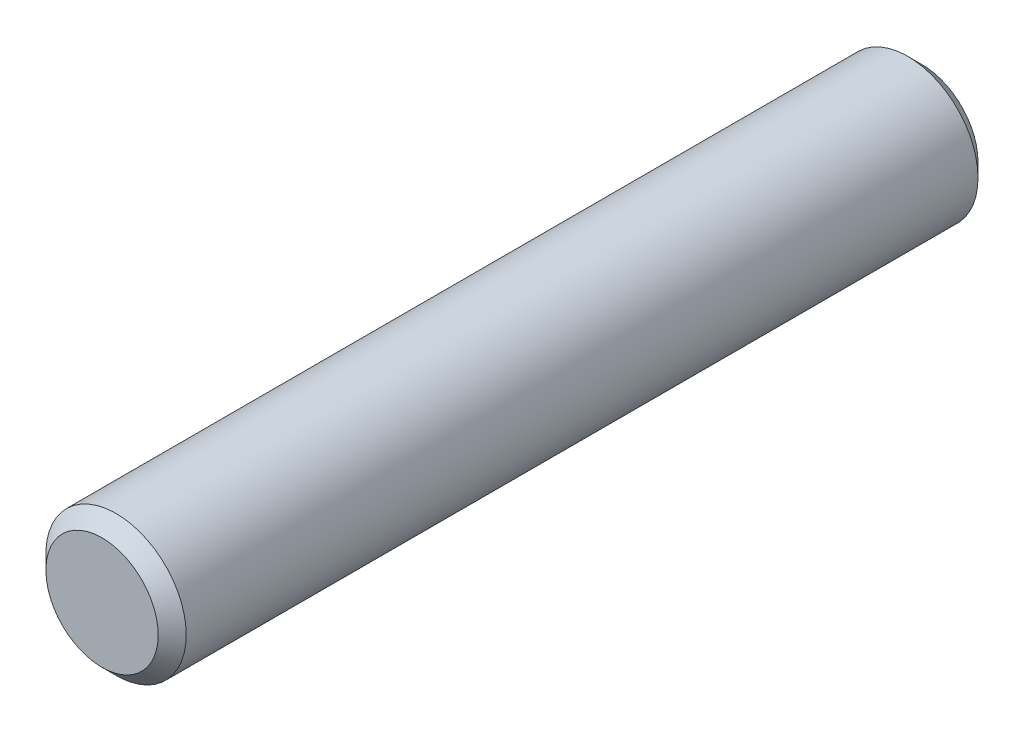
ISO-10303-21;
HEADER;
FILE_DESCRIPTION(('STEP AP214'),'2;1');
FILE_NAME('part.step','',(''),(''),'','','');
FILE_SCHEMA(('AUTOMOTIVE_DESIGN { 1 0 10303 214 1 1 1 1 }'));
ENDSEC;
DATA;
#1=APPLICATION_CONTEXT('core data for automotive mechanical design processes');
#2=APPLICATION_PROTOCOL_DEFINITION('international standard','automotive_design',2000,#1);
#3=PRODUCT_CONTEXT('',#1,'mechanical');
#4=PRODUCT('Part','Part','',(#3));
#5=PRODUCT_RELATED_PRODUCT_CATEGORY('part','',(#4));
#6=PRODUCT_DEFINITION_FORMATION('','',#4);
#7=PRODUCT_DEFINITION_CONTEXT('part definition',#1,'design');
#8=PRODUCT_DEFINITION('design','',#6,#7);
#9=PRODUCT_DEFINITION_SHAPE('','',#8);
#10=(LENGTH_UNIT() NAMED_UNIT(*) SI_UNIT(.MILLI.,.METRE.));
#11=(NAMED_UNIT(*) PLANE_ANGLE_UNIT() SI_UNIT($,.RADIAN.));
#12=(NAMED_UNIT(*) SI_UNIT($,.STERADIAN.) SOLID_ANGLE_UNIT());
#13=UNCERTAINTY_MEASURE_WITH_UNIT(LENGTH_MEASURE(1.E-05),#10,'distance_accuracy_value','');
#14=(GEOMETRIC_REPRESENTATION_CONTEXT(3) GLOBAL_UNCERTAINTY_ASSIGNED_CONTEXT((#13)) GLOBAL_UNIT_ASSIGNED_CONTEXT((#10,
#11,#12)) REPRESENTATION_CONTEXT('',''));
#15=CARTESIAN_POINT('',(0.,0.,0.));
#16=DIRECTION('',(0.,0.,1.));
#17=DIRECTION('',(1.,0.,0.));
#18=AXIS2_PLACEMENT_3D('',#15,#16,#17);
#19=CARTESIAN_POINT('',(0.,0.,23.368));
#20=DIRECTION('',(0.,0.,-1.));
#21=DIRECTION('',(-1.,0.,0.));
#22=AXIS2_PLACEMENT_3D('',#19,#20,#21);
#23=CYLINDRICAL_SURFACE('',#22,4.);
#24=CARTESIAN_POINT('',(0.,0.,-22.568));
#25=DIRECTION('',(0.,0.,1.));
#26=DIRECTION('',(1.,0.,0.));
#27=AXIS2_PLACEMENT_3D('',#24,#25,#26);
#28=CIRCLE('',#27,4.);
#29=CARTESIAN_POINT('',(4.,0.,-22.568));
#30=VERTEX_POINT('',#29);
#31=EDGE_CURVE('E50',#30,#30,#28,.T.);
#32=ORIENTED_EDGE('',*,*,#31,.T.);
#33=EDGE_LOOP('',(#32));
#34=FACE_BOUND('',#33,.T.);
#35=CARTESIAN_POINT('',(0.,0.,22.568));
#36=DIRECTION('',(0.,0.,1.));
#37=DIRECTION('',(1.,0.,0.));
#38=AXIS2_PLACEMENT_3D('',#35,#36,#37);
#39=CIRCLE('',#38,4.);
#40=CARTESIAN_POINT('',(4.,0.,22.568));
#41=VERTEX_POINT('',#40);
#42=EDGE_CURVE('E55',#41,#41,#39,.F.);
#43=ORIENTED_EDGE('',*,*,#42,.T.);
#44=EDGE_LOOP('',(#43));
#45=FACE_BOUND('',#44,.T.);
#46=ADVANCED_FACE('F37',(#34,#45),#23,.T.);
#47=CARTESIAN_POINT('',(0.,0.,23.368));
#48=DIRECTION('',(0.,0.,1.));
#49=DIRECTION('',(1.,0.,0.));
#50=AXIS2_PLACEMENT_3D('',#47,#48,#49);
#51=PLANE('',#50);
#52=CARTESIAN_POINT('',(0.,0.,23.368));
#53=DIRECTION('',(0.,0.,1.));
#54=DIRECTION('',(1.,0.,0.));
#55=AXIS2_PLACEMENT_3D('',#52,#53,#54);
#56=CIRCLE('',#55,3.2);
#57=CARTESIAN_POINT('',(3.2,0.,23.368));
#58=VERTEX_POINT('',#57);
#59=EDGE_CURVE('E10',#58,#58,#56,.T.);
#60=ORIENTED_EDGE('',*,*,#59,.T.);
#61=EDGE_LOOP('',(#60));
#62=FACE_BOUND('',#61,.T.);
#63=ADVANCED_FACE('F72',(#62),#51,.T.);
#64=CARTESIAN_POINT('',(0.,0.,-23.368));
#65=DIRECTION('',(0.,0.,1.));
#66=DIRECTION('',(1.,0.,0.));
#67=AXIS2_PLACEMENT_3D('',#64,#65,#66);
#68=PLANE('',#67);
#69=CARTESIAN_POINT('',(0.,0.,-23.368));
#70=DIRECTION('',(0.,0.,1.));
#71=DIRECTION('',(1.,0.,0.));
#72=AXIS2_PLACEMENT_3D('',#69,#70,#71);
#73=CIRCLE('',#72,3.2);
#74=CARTESIAN_POINT('',(3.2,0.,-23.368));
#75=VERTEX_POINT('',#74);
#76=EDGE_CURVE('E45',#75,#75,#73,.F.);
#77=ORIENTED_EDGE('',*,*,#76,.T.);
#78=EDGE_LOOP('',(#77));
#79=FACE_BOUND('',#78,.T.);
#80=ADVANCED_FACE('F69',(#79),#68,.F.);
#81=CARTESIAN_POINT('',(0.,0.,-22.568));
#82=DIRECTION('',(0.,0.,1.));
#83=DIRECTION('',(1.,0.,0.));
#84=AXIS2_PLACEMENT_3D('',#81,#82,#83);
#85=CONICAL_SURFACE('',#84,4.,0.78539816339745);
#86=ORIENTED_EDGE('',*,*,#76,.F.);
#87=EDGE_LOOP('',(#86));
#88=FACE_BOUND('',#87,.T.);
#89=ORIENTED_EDGE('',*,*,#31,.F.);
#90=EDGE_LOOP('',(#89));
#91=FACE_BOUND('',#90,.T.);
#92=ADVANCED_FACE('F65',(#88,#91),#85,.T.);
#93=CARTESIAN_POINT('',(0.,0.,23.368));
#94=DIRECTION('',(0.,0.,-1.));
#95=DIRECTION('',(-1.,0.,0.));
#96=AXIS2_PLACEMENT_3D('',#93,#94,#95);
#97=CONICAL_SURFACE('',#96,3.2,0.785398163397444);
#98=ORIENTED_EDGE('',*,*,#42,.F.);
#99=EDGE_LOOP('',(#98));
#100=FACE_BOUND('',#99,.T.);
#101=ORIENTED_EDGE('',*,*,#59,.F.);
#102=EDGE_LOOP('',(#101));
#103=FACE_BOUND('',#102,.T.);
#104=ADVANCED_FACE('F39',(#100,#103),#97,.T.);
#105=CLOSED_SHELL('',(#46,#63,#80,#92,#104));
#106=MANIFOLD_SOLID_BREP('B2',#105);
#107=ADVANCED_BREP_SHAPE_REPRESENTATION('',(#18,#106),#14);
#108=SHAPE_DEFINITION_REPRESENTATION(#9,#107);
ENDSEC;
END-ISO-10303-21;
